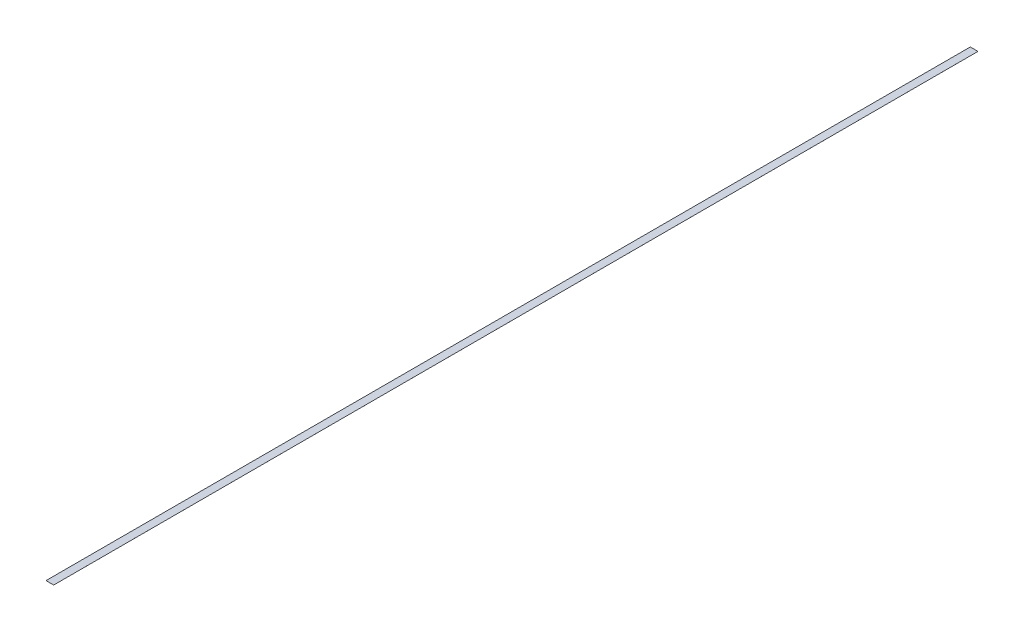
ISO-10303-21;
HEADER;
FILE_DESCRIPTION(('STEP AP214'),'2;1');
FILE_NAME('part.step','',(''),(''),'','','');
FILE_SCHEMA(('AUTOMOTIVE_DESIGN { 1 0 10303 214 1 1 1 1 }'));
ENDSEC;
DATA;
#1=APPLICATION_CONTEXT('core data for automotive mechanical design processes');
#2=APPLICATION_PROTOCOL_DEFINITION('international standard','automotive_design',2000,#1);
#3=PRODUCT_CONTEXT('',#1,'mechanical');
#4=PRODUCT('Part','Part','',(#3));
#5=PRODUCT_RELATED_PRODUCT_CATEGORY('part','',(#4));
#6=PRODUCT_DEFINITION_FORMATION('','',#4);
#7=PRODUCT_DEFINITION_CONTEXT('part definition',#1,'design');
#8=PRODUCT_DEFINITION('design','',#6,#7);
#9=PRODUCT_DEFINITION_SHAPE('','',#8);
#10=(LENGTH_UNIT() NAMED_UNIT(*) SI_UNIT(.MILLI.,.METRE.));
#11=(NAMED_UNIT(*) PLANE_ANGLE_UNIT() SI_UNIT($,.RADIAN.));
#12=(NAMED_UNIT(*) SI_UNIT($,.STERADIAN.) SOLID_ANGLE_UNIT());
#13=UNCERTAINTY_MEASURE_WITH_UNIT(LENGTH_MEASURE(1.E-05),#10,'distance_accuracy_value','');
#14=(GEOMETRIC_REPRESENTATION_CONTEXT(3) GLOBAL_UNCERTAINTY_ASSIGNED_CONTEXT((#13)) GLOBAL_UNIT_ASSIGNED_CONTEXT((#10,
#11,#12)) REPRESENTATION_CONTEXT('',''));
#15=CARTESIAN_POINT('',(0.,0.,0.));
#16=DIRECTION('',(0.,0.,1.));
#17=DIRECTION('',(1.,0.,0.));
#18=AXIS2_PLACEMENT_3D('',#15,#16,#17);
#19=CARTESIAN_POINT('',(-12.7,-0.0127000000000109,1524.));
#20=DIRECTION('',(1.,0.,0.));
#21=DIRECTION('',(0.,0.,-1.));
#22=AXIS2_PLACEMENT_3D('',#19,#20,#21);
#23=PLANE('',#22);
#24=DIRECTION('',(0.,-1.,0.));
#25=VECTOR('',#24,1.);
#26=CARTESIAN_POINT('',(-12.7,-0.0127000000000109,-1524.));
#27=LINE('',#26,#25);
#28=CARTESIAN_POINT('',(-12.7,0.0126999999999891,-1524.));
#29=VERTEX_POINT('',#28);
#30=CARTESIAN_POINT('',(-12.7,-0.0127000000000109,-1524.));
#31=VERTEX_POINT('',#30);
#32=EDGE_CURVE('E97',#29,#31,#27,.T.);
#33=ORIENTED_EDGE('',*,*,#32,.T.);
#34=DIRECTION('',(0.,0.,-1.));
#35=VECTOR('',#34,1.);
#36=CARTESIAN_POINT('',(-12.7,-0.0127000000000109,1524.));
#37=LINE('',#36,#35);
#38=CARTESIAN_POINT('',(-12.7,-0.0127000000000109,1524.));
#39=VERTEX_POINT('',#38);
#40=EDGE_CURVE('E11',#39,#31,#37,.T.);
#41=ORIENTED_EDGE('',*,*,#40,.F.);
#42=DIRECTION('',(0.,-1.,0.));
#43=VECTOR('',#42,1.);
#44=CARTESIAN_POINT('',(-12.7,-0.0127000000000109,1524.));
#45=LINE('',#44,#43);
#46=CARTESIAN_POINT('',(-12.7,0.0126999999999891,1524.));
#47=VERTEX_POINT('',#46);
#48=EDGE_CURVE('E85',#47,#39,#45,.T.);
#49=ORIENTED_EDGE('',*,*,#48,.F.);
#50=DIRECTION('',(0.,0.,-1.));
#51=VECTOR('',#50,1.);
#52=CARTESIAN_POINT('',(-12.7,0.0126999999999891,1524.));
#53=LINE('',#52,#51);
#54=EDGE_CURVE('E93',#47,#29,#53,.T.);
#55=ORIENTED_EDGE('',*,*,#54,.T.);
#56=EDGE_LOOP('',(#33,#41,#49,#55));
#57=FACE_BOUND('',#56,.T.);
#58=ADVANCED_FACE('F34',(#57),#23,.F.);
#59=CARTESIAN_POINT('',(12.7,-0.0126999999999907,1524.));
#60=DIRECTION('',(0.,1.,0.));
#61=DIRECTION('',(-1.,0.,0.));
#62=AXIS2_PLACEMENT_3D('',#59,#60,#61);
#63=PLANE('',#62);
#64=DIRECTION('',(1.,0.,0.));
#65=VECTOR('',#64,1.);
#66=CARTESIAN_POINT('',(12.7,-0.0126999999999907,-1524.));
#67=LINE('',#66,#65);
#68=CARTESIAN_POINT('',(12.7,-0.0126999999999907,-1524.));
#69=VERTEX_POINT('',#68);
#70=EDGE_CURVE('E89',#31,#69,#67,.T.);
#71=ORIENTED_EDGE('',*,*,#70,.T.);
#72=DIRECTION('',(0.,0.,-1.));
#73=VECTOR('',#72,1.);
#74=CARTESIAN_POINT('',(12.7,-0.0126999999999907,1524.));
#75=LINE('',#74,#73);
#76=CARTESIAN_POINT('',(12.7,-0.0126999999999907,1524.));
#77=VERTEX_POINT('',#76);
#78=EDGE_CURVE('E42',#77,#69,#75,.T.);
#79=ORIENTED_EDGE('',*,*,#78,.F.);
#80=DIRECTION('',(1.,0.,0.));
#81=VECTOR('',#80,1.);
#82=CARTESIAN_POINT('',(12.7,-0.0126999999999907,1524.));
#83=LINE('',#82,#81);
#84=EDGE_CURVE('E80',#39,#77,#83,.T.);
#85=ORIENTED_EDGE('',*,*,#84,.F.);
#86=ORIENTED_EDGE('',*,*,#40,.T.);
#87=EDGE_LOOP('',(#71,#79,#85,#86));
#88=FACE_BOUND('',#87,.T.);
#89=ADVANCED_FACE('F88',(#88),#63,.F.);
#90=CARTESIAN_POINT('',(12.7,0.0126999999999938,1524.));
#91=DIRECTION('',(-1.,0.,0.));
#92=DIRECTION('',(0.,0.,1.));
#93=AXIS2_PLACEMENT_3D('',#90,#91,#92);
#94=PLANE('',#93);
#95=DIRECTION('',(0.,1.,0.));
#96=VECTOR('',#95,1.);
#97=CARTESIAN_POINT('',(12.7,0.0126999999999938,-1524.));
#98=LINE('',#97,#96);
#99=CARTESIAN_POINT('',(12.7,0.0126999999999938,-1524.));
#100=VERTEX_POINT('',#99);
#101=EDGE_CURVE('E67',#69,#100,#98,.T.);
#102=ORIENTED_EDGE('',*,*,#101,.T.);
#103=DIRECTION('',(0.,0.,-1.));
#104=VECTOR('',#103,1.);
#105=CARTESIAN_POINT('',(12.7,0.0126999999999938,1524.));
#106=LINE('',#105,#104);
#107=CARTESIAN_POINT('',(12.7,0.0126999999999938,1524.));
#108=VERTEX_POINT('',#107);
#109=EDGE_CURVE('E90',#108,#100,#106,.T.);
#110=ORIENTED_EDGE('',*,*,#109,.F.);
#111=DIRECTION('',(0.,1.,0.));
#112=VECTOR('',#111,1.);
#113=CARTESIAN_POINT('',(12.7,0.0126999999999938,1524.));
#114=LINE('',#113,#112);
#115=EDGE_CURVE('E83',#77,#108,#114,.T.);
#116=ORIENTED_EDGE('',*,*,#115,.F.);
#117=ORIENTED_EDGE('',*,*,#78,.T.);
#118=EDGE_LOOP('',(#102,#110,#116,#117));
#119=FACE_BOUND('',#118,.T.);
#120=ADVANCED_FACE('F91',(#119),#94,.F.);
#121=CARTESIAN_POINT('',(-12.7,0.0126999999999891,1524.));
#122=DIRECTION('',(0.,-1.,0.));
#123=DIRECTION('',(1.,0.,0.));
#124=AXIS2_PLACEMENT_3D('',#121,#122,#123);
#125=PLANE('',#124);
#126=DIRECTION('',(-1.,0.,0.));
#127=VECTOR('',#126,1.);
#128=CARTESIAN_POINT('',(-12.7,0.0126999999999891,-1524.));
#129=LINE('',#128,#127);
#130=EDGE_CURVE('E73',#100,#29,#129,.T.);
#131=ORIENTED_EDGE('',*,*,#130,.T.);
#132=ORIENTED_EDGE('',*,*,#54,.F.);
#133=DIRECTION('',(-1.,0.,0.));
#134=VECTOR('',#133,1.);
#135=CARTESIAN_POINT('',(-12.7,0.0126999999999891,1524.));
#136=LINE('',#135,#134);
#137=EDGE_CURVE('E50',#108,#47,#136,.T.);
#138=ORIENTED_EDGE('',*,*,#137,.F.);
#139=ORIENTED_EDGE('',*,*,#109,.T.);
#140=EDGE_LOOP('',(#131,#132,#138,#139));
#141=FACE_BOUND('',#140,.T.);
#142=ADVANCED_FACE('F104',(#141),#125,.F.);
#143=CARTESIAN_POINT('',(0.,0.,1524.));
#144=DIRECTION('',(0.,0.,-1.));
#145=DIRECTION('',(-1.,0.,0.));
#146=AXIS2_PLACEMENT_3D('',#143,#144,#145);
#147=PLANE('',#146);
#148=ORIENTED_EDGE('',*,*,#48,.T.);
#149=ORIENTED_EDGE('',*,*,#84,.T.);
#150=ORIENTED_EDGE('',*,*,#115,.T.);
#151=ORIENTED_EDGE('',*,*,#137,.T.);
#152=EDGE_LOOP('',(#148,#149,#150,#151));
#153=FACE_BOUND('',#152,.T.);
#154=ADVANCED_FACE('F81',(#153),#147,.F.);
#155=CARTESIAN_POINT('',(0.,0.,-1524.));
#156=DIRECTION('',(0.,0.,-1.));
#157=DIRECTION('',(-1.,0.,0.));
#158=AXIS2_PLACEMENT_3D('',#155,#156,#157);
#159=PLANE('',#158);
#160=ORIENTED_EDGE('',*,*,#32,.F.);
#161=ORIENTED_EDGE('',*,*,#130,.F.);
#162=ORIENTED_EDGE('',*,*,#101,.F.);
#163=ORIENTED_EDGE('',*,*,#70,.F.);
#164=EDGE_LOOP('',(#160,#161,#162,#163));
#165=FACE_BOUND('',#164,.T.);
#166=ADVANCED_FACE('F107',(#165),#159,.T.);
#167=CLOSED_SHELL('',(#58,#89,#120,#142,#154,#166));
#168=MANIFOLD_SOLID_BREP('B2',#167);
#169=ADVANCED_BREP_SHAPE_REPRESENTATION('',(#18,#168),#14);
#170=SHAPE_DEFINITION_REPRESENTATION(#9,#169);
ENDSEC;
END-ISO-10303-21;
